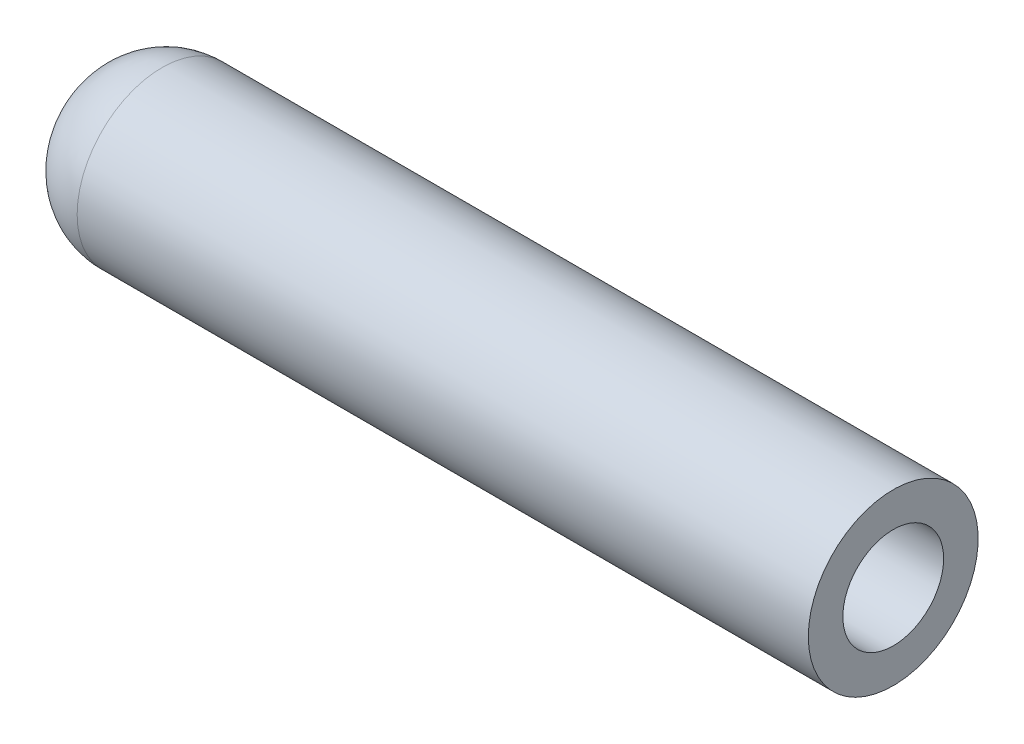
ISO-10303-21;
HEADER;
FILE_DESCRIPTION(('STEP AP214'),'2;1');
FILE_NAME('part.step','',(''),(''),'','','');
FILE_SCHEMA(('AUTOMOTIVE_DESIGN { 1 0 10303 214 1 1 1 1 }'));
ENDSEC;
DATA;
#1=APPLICATION_CONTEXT('core data for automotive mechanical design processes');
#2=APPLICATION_PROTOCOL_DEFINITION('international standard','automotive_design',2000,#1);
#3=PRODUCT_CONTEXT('',#1,'mechanical');
#4=PRODUCT('Part','Part','',(#3));
#5=PRODUCT_RELATED_PRODUCT_CATEGORY('part','',(#4));
#6=PRODUCT_DEFINITION_FORMATION('','',#4);
#7=PRODUCT_DEFINITION_CONTEXT('part definition',#1,'design');
#8=PRODUCT_DEFINITION('design','',#6,#7);
#9=PRODUCT_DEFINITION_SHAPE('','',#8);
#10=(LENGTH_UNIT() NAMED_UNIT(*) SI_UNIT(.MILLI.,.METRE.));
#11=(NAMED_UNIT(*) PLANE_ANGLE_UNIT() SI_UNIT($,.RADIAN.));
#12=(NAMED_UNIT(*) SI_UNIT($,.STERADIAN.) SOLID_ANGLE_UNIT());
#13=UNCERTAINTY_MEASURE_WITH_UNIT(LENGTH_MEASURE(1.E-05),#10,'distance_accuracy_value','');
#14=(GEOMETRIC_REPRESENTATION_CONTEXT(3) GLOBAL_UNCERTAINTY_ASSIGNED_CONTEXT((#13)) GLOBAL_UNIT_ASSIGNED_CONTEXT((#10,
#11,#12)) REPRESENTATION_CONTEXT('',''));
#15=CARTESIAN_POINT('',(0.,0.,0.));
#16=DIRECTION('',(0.,0.,1.));
#17=DIRECTION('',(1.,0.,0.));
#18=AXIS2_PLACEMENT_3D('',#15,#16,#17);
#19=CARTESIAN_POINT('',(0.,-0.928107976868217,0.928107976868217));
#20=DIRECTION('',(0.,-1.,0.));
#21=DIRECTION('',(0.,0.,1.));
#22=AXIS2_PLACEMENT_3D('',#19,#20,#21);
#23=CIRCLE('',#22,7.5);
#24=TRIMMED_CURVE('',#23,(PARAMETER_VALUE(-1.69486208869549)),
(PARAMETER_VALUE(1.69486208869549)),.T.,.PARAMETER.);
#25=CARTESIAN_POINT('',(0.,-0.928107976868217,0.));
#26=DIRECTION('',(-1.,0.,0.));
#27=AXIS1_PLACEMENT('',#25,#26);
#28=SURFACE_OF_REVOLUTION('',#24,#27);
#29=CARTESIAN_POINT('',(-7.44235282577181,-0.928107976868217,0.));
#30=VERTEX_POINT('',#29);
#31=VERTEX_LOOP('',#30);
#32=FACE_BOUND('',#31,.T.);
#33=CARTESIAN_POINT('',(0.,-0.928107976868217,0.));
#34=DIRECTION('',(-1.,0.,0.));
#35=DIRECTION('',(0.,0.,1.));
#36=AXIS2_PLACEMENT_3D('',#33,#34,#35);
#37=CIRCLE('',#36,8.42810797686822);
#38=CARTESIAN_POINT('',(0.,-0.928107976868217,8.42810797686822));
#39=VERTEX_POINT('',#38);
#40=EDGE_CURVE('E38',#39,#39,#37,.T.);
#41=ORIENTED_EDGE('',*,*,#40,.T.);
#42=EDGE_LOOP('',(#41));
#43=FACE_BOUND('',#42,.T.);
#44=ADVANCED_FACE('F32',(#32,#43),#28,.T.);
#45=CARTESIAN_POINT('',(72.5576471742282,-0.928107976868217,0.));
#46=DIRECTION('',(-1.,0.,0.));
#47=DIRECTION('',(0.,0.,1.));
#48=AXIS2_PLACEMENT_3D('',#45,#46,#47);
#49=PLANE('',#48);
#50=CARTESIAN_POINT('',(72.5576471742282,-0.928107976868217,0.));
#51=DIRECTION('',(1.,0.,0.));
#52=DIRECTION('',(0.,0.,-1.));
#53=AXIS2_PLACEMENT_3D('',#50,#51,#52);
#54=CIRCLE('',#53,5.);
#55=CARTESIAN_POINT('',(72.5576471742282,-0.928107976868217,-5.));
#56=VERTEX_POINT('',#55);
#57=EDGE_CURVE('E49',#56,#56,#54,.T.);
#58=ORIENTED_EDGE('',*,*,#57,.F.);
#59=EDGE_LOOP('',(#58));
#60=FACE_BOUND('',#59,.T.);
#61=CARTESIAN_POINT('',(72.5576471742282,-0.928107976868217,0.));
#62=DIRECTION('',(-1.,0.,0.));
#63=DIRECTION('',(0.,0.,1.));
#64=AXIS2_PLACEMENT_3D('',#61,#62,#63);
#65=CIRCLE('',#64,8.42810797686822);
#66=CARTESIAN_POINT('',(72.5576471742282,-0.928107976868217,8.42810797686822));
#67=VERTEX_POINT('',#66);
#68=EDGE_CURVE('E11',#67,#67,#65,.T.);
#69=ORIENTED_EDGE('',*,*,#68,.F.);
#70=EDGE_LOOP('',(#69));
#71=FACE_BOUND('',#70,.T.);
#72=ADVANCED_FACE('F43',(#60,#71),#49,.F.);
#73=CARTESIAN_POINT('',(-7.44235282577181,-0.928107976868217,0.));
#74=DIRECTION('',(-1.,0.,0.));
#75=DIRECTION('',(0.,0.,1.));
#76=AXIS2_PLACEMENT_3D('',#73,#74,#75);
#77=CYLINDRICAL_SURFACE('',#76,8.42810797686822);
#78=ORIENTED_EDGE('',*,*,#40,.F.);
#79=EDGE_LOOP('',(#78));
#80=FACE_BOUND('',#79,.T.);
#81=ORIENTED_EDGE('',*,*,#68,.T.);
#82=EDGE_LOOP('',(#81));
#83=FACE_BOUND('',#82,.T.);
#84=ADVANCED_FACE('F59',(#80,#83),#77,.T.);
#85=CARTESIAN_POINT('',(22.5576471742282,-0.928107976868217,0.));
#86=DIRECTION('',(1.,0.,0.));
#87=DIRECTION('',(0.,0.,-1.));
#88=AXIS2_PLACEMENT_3D('',#85,#86,#87);
#89=CYLINDRICAL_SURFACE('',#88,5.);
#90=CARTESIAN_POINT('',(22.5576471742282,-0.928107976868217,0.));
#91=DIRECTION('',(1.,0.,0.));
#92=DIRECTION('',(0.,0.,-1.));
#93=AXIS2_PLACEMENT_3D('',#90,#91,#92);
#94=CIRCLE('',#93,5.);
#95=CARTESIAN_POINT('',(22.5576471742282,-0.928107976868217,-5.));
#96=VERTEX_POINT('',#95);
#97=EDGE_CURVE('E47',#96,#96,#94,.T.);
#98=ORIENTED_EDGE('',*,*,#97,.F.);
#99=EDGE_LOOP('',(#98));
#100=FACE_BOUND('',#99,.T.);
#101=ORIENTED_EDGE('',*,*,#57,.T.);
#102=EDGE_LOOP('',(#101));
#103=FACE_BOUND('',#102,.T.);
#104=ADVANCED_FACE('F55',(#100,#103),#89,.F.);
#105=CARTESIAN_POINT('',(22.5576471742282,-0.928107976868217,0.));
#106=DIRECTION('',(1.,0.,0.));
#107=DIRECTION('',(0.,0.,-1.));
#108=AXIS2_PLACEMENT_3D('',#105,#106,#107);
#109=PLANE('',#108);
#110=ORIENTED_EDGE('',*,*,#97,.T.);
#111=EDGE_LOOP('',(#110));
#112=FACE_BOUND('',#111,.T.);
#113=ADVANCED_FACE('F67',(#112),#109,.T.);
#114=CLOSED_SHELL('',(#44,#72,#84,#104,#113));
#115=MANIFOLD_SOLID_BREP('B2',#114);
#116=ADVANCED_BREP_SHAPE_REPRESENTATION('',(#18,#115),#14);
#117=SHAPE_DEFINITION_REPRESENTATION(#9,#116);
ENDSEC;
END-ISO-10303-21;
